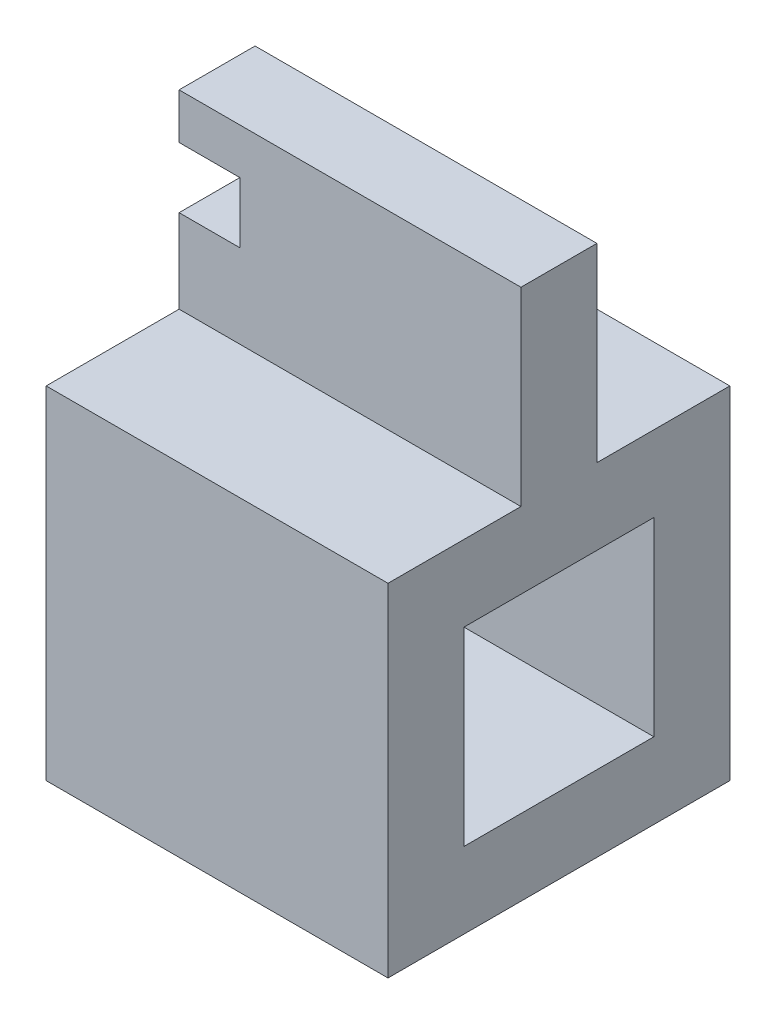
ISO-10303-21;
HEADER;
FILE_DESCRIPTION(('STEP AP214'),'2;1');
FILE_NAME('part.step','',(''),(''),'','','');
FILE_SCHEMA(('AUTOMOTIVE_DESIGN { 1 0 10303 214 1 1 1 1 }'));
ENDSEC;
DATA;
#1=APPLICATION_CONTEXT('core data for automotive mechanical design processes');
#2=APPLICATION_PROTOCOL_DEFINITION('international standard','automotive_design',2000,#1);
#3=PRODUCT_CONTEXT('',#1,'mechanical');
#4=PRODUCT('Part','Part','',(#3));
#5=PRODUCT_RELATED_PRODUCT_CATEGORY('part','',(#4));
#6=PRODUCT_DEFINITION_FORMATION('','',#4);
#7=PRODUCT_DEFINITION_CONTEXT('part definition',#1,'design');
#8=PRODUCT_DEFINITION('design','',#6,#7);
#9=PRODUCT_DEFINITION_SHAPE('','',#8);
#10=(LENGTH_UNIT() NAMED_UNIT(*) SI_UNIT(.MILLI.,.METRE.));
#11=(NAMED_UNIT(*) PLANE_ANGLE_UNIT() SI_UNIT($,.RADIAN.));
#12=(NAMED_UNIT(*) SI_UNIT($,.STERADIAN.) SOLID_ANGLE_UNIT());
#13=UNCERTAINTY_MEASURE_WITH_UNIT(LENGTH_MEASURE(1.E-05),#10,'distance_accuracy_value','');
#14=(GEOMETRIC_REPRESENTATION_CONTEXT(3) GLOBAL_UNCERTAINTY_ASSIGNED_CONTEXT((#13)) GLOBAL_UNIT_ASSIGNED_CONTEXT((#10,
#11,#12)) REPRESENTATION_CONTEXT('',''));
#15=CARTESIAN_POINT('',(0.,0.,0.));
#16=DIRECTION('',(0.,0.,1.));
#17=DIRECTION('',(1.,0.,0.));
#18=AXIS2_PLACEMENT_3D('',#15,#16,#17);
#19=CARTESIAN_POINT('',(0.,0.,0.));
#20=DIRECTION('',(1.,0.,0.));
#21=DIRECTION('',(0.,0.,-1.));
#22=AXIS2_PLACEMENT_3D('',#19,#20,#21);
#23=PLANE('',#22);
#24=DIRECTION('',(0.,-1.,0.));
#25=VECTOR('',#24,1.);
#26=CARTESIAN_POINT('',(0.,-2.5,2.5));
#27=LINE('',#26,#25);
#28=CARTESIAN_POINT('',(0.,2.5,2.5));
#29=VERTEX_POINT('',#28);
#30=CARTESIAN_POINT('',(0.,-2.5,2.5));
#31=VERTEX_POINT('',#30);
#32=EDGE_CURVE('E183',#29,#31,#27,.T.);
#33=ORIENTED_EDGE('',*,*,#32,.T.);
#34=DIRECTION('',(0.,0.,-1.));
#35=VECTOR('',#34,1.);
#36=CARTESIAN_POINT('',(0.,-2.5,-2.5));
#37=LINE('',#36,#35);
#38=CARTESIAN_POINT('',(0.,-2.5,-2.5));
#39=VERTEX_POINT('',#38);
#40=EDGE_CURVE('E197',#31,#39,#37,.T.);
#41=ORIENTED_EDGE('',*,*,#40,.T.);
#42=DIRECTION('',(0.,1.,0.));
#43=VECTOR('',#42,1.);
#44=CARTESIAN_POINT('',(0.,-2.5,-2.5));
#45=LINE('',#44,#43);
#46=CARTESIAN_POINT('',(0.,2.5,-2.5));
#47=VERTEX_POINT('',#46);
#48=EDGE_CURVE('E200',#39,#47,#45,.T.);
#49=ORIENTED_EDGE('',*,*,#48,.T.);
#50=DIRECTION('',(0.,0.,1.));
#51=VECTOR('',#50,1.);
#52=CARTESIAN_POINT('',(0.,2.5,-2.5));
#53=LINE('',#52,#51);
#54=EDGE_CURVE('E187',#47,#29,#53,.T.);
#55=ORIENTED_EDGE('',*,*,#54,.T.);
#56=EDGE_LOOP('',(#33,#41,#49,#55));
#57=FACE_BOUND('',#56,.T.);
#58=DIRECTION('',(0.,0.,1.));
#59=VECTOR('',#58,1.);
#60=CARTESIAN_POINT('',(0.,6.7,-4.));
#61=LINE('',#60,#59);
#62=CARTESIAN_POINT('',(0.,6.7,-0.999999999999998));
#63=VERTEX_POINT('',#62);
#64=CARTESIAN_POINT('',(0.,6.7,0.999999999999999));
#65=VERTEX_POINT('',#64);
#66=EDGE_CURVE('E167',#63,#65,#61,.T.);
#67=ORIENTED_EDGE('',*,*,#66,.F.);
#68=DIRECTION('',(0.,-1.,0.));
#69=VECTOR('',#68,1.);
#70=CARTESIAN_POINT('',(0.,9.5,-0.999999999999999));
#71=LINE('',#70,#69);
#72=CARTESIAN_POINT('',(0.,4.5,-0.999999999999999));
#73=VERTEX_POINT('',#72);
#74=EDGE_CURVE('E172',#63,#73,#71,.T.);
#75=ORIENTED_EDGE('',*,*,#74,.T.);
#76=DIRECTION('',(0.,0.,1.));
#77=VECTOR('',#76,1.);
#78=CARTESIAN_POINT('',(0.,4.5,-4.5));
#79=LINE('',#78,#77);
#80=CARTESIAN_POINT('',(0.,4.5,-4.5));
#81=VERTEX_POINT('',#80);
#82=EDGE_CURVE('E219',#81,#73,#79,.T.);
#83=ORIENTED_EDGE('',*,*,#82,.F.);
#84=DIRECTION('',(0.,1.,0.));
#85=VECTOR('',#84,1.);
#86=CARTESIAN_POINT('',(0.,-4.5,-4.5));
#87=LINE('',#86,#85);
#88=CARTESIAN_POINT('',(0.,-4.5,-4.5));
#89=VERTEX_POINT('',#88);
#90=EDGE_CURVE('E231',#89,#81,#87,.T.);
#91=ORIENTED_EDGE('',*,*,#90,.F.);
#92=DIRECTION('',(0.,0.,-1.));
#93=VECTOR('',#92,1.);
#94=CARTESIAN_POINT('',(0.,-4.5,-4.5));
#95=LINE('',#94,#93);
#96=CARTESIAN_POINT('',(0.,-4.5,4.5));
#97=VERTEX_POINT('',#96);
#98=EDGE_CURVE('E229',#97,#89,#95,.T.);
#99=ORIENTED_EDGE('',*,*,#98,.F.);
#100=DIRECTION('',(0.,-1.,0.));
#101=VECTOR('',#100,1.);
#102=CARTESIAN_POINT('',(0.,-4.5,4.5));
#103=LINE('',#102,#101);
#104=CARTESIAN_POINT('',(0.,4.5,4.5));
#105=VERTEX_POINT('',#104);
#106=EDGE_CURVE('E214',#105,#97,#103,.T.);
#107=ORIENTED_EDGE('',*,*,#106,.F.);
#108=CARTESIAN_POINT('',(0.,4.5,1.));
#109=VERTEX_POINT('',#108);
#110=EDGE_CURVE('E233',#109,#105,#79,.T.);
#111=ORIENTED_EDGE('',*,*,#110,.F.);
#112=DIRECTION('',(0.,-1.,0.));
#113=VECTOR('',#112,1.);
#114=CARTESIAN_POINT('',(0.,9.5,1.));
#115=LINE('',#114,#113);
#116=EDGE_CURVE('E173',#65,#109,#115,.T.);
#117=ORIENTED_EDGE('',*,*,#116,.F.);
#118=EDGE_LOOP('',(#67,#75,#83,#91,#99,#107,#111,#117));
#119=FACE_BOUND('',#118,.T.);
#120=ADVANCED_FACE('F34',(#57,#119),#23,.F.);
#121=CARTESIAN_POINT('',(0.,9.5,-0.999999999999998));
#122=DIRECTION('',(0.,0.,1.));
#123=DIRECTION('',(1.,0.,0.));
#124=AXIS2_PLACEMENT_3D('',#121,#122,#123);
#125=PLANE('',#124);
#126=DIRECTION('',(-1.,0.,0.));
#127=VECTOR('',#126,1.);
#128=CARTESIAN_POINT('',(0.,6.7,-0.999999999999998));
#129=LINE('',#128,#127);
#130=CARTESIAN_POINT('',(1.6,6.7,-0.999999999999998));
#131=VERTEX_POINT('',#130);
#132=EDGE_CURVE('E267',#131,#63,#129,.T.);
#133=ORIENTED_EDGE('',*,*,#132,.F.);
#134=DIRECTION('',(0.,1.,0.));
#135=VECTOR('',#134,1.);
#136=CARTESIAN_POINT('',(1.6,9.5,-0.999999999999998));
#137=LINE('',#136,#135);
#138=CARTESIAN_POINT('',(1.6,8.3,-0.999999999999998));
#139=VERTEX_POINT('',#138);
#140=EDGE_CURVE('E263',#131,#139,#137,.T.);
#141=ORIENTED_EDGE('',*,*,#140,.T.);
#142=DIRECTION('',(-1.,0.,0.));
#143=VECTOR('',#142,1.);
#144=CARTESIAN_POINT('',(0.,8.3,-0.999999999999998));
#145=LINE('',#144,#143);
#146=CARTESIAN_POINT('',(0.,8.3,-0.999999999999998));
#147=VERTEX_POINT('',#146);
#148=EDGE_CURVE('E278',#139,#147,#145,.T.);
#149=ORIENTED_EDGE('',*,*,#148,.T.);
#150=CARTESIAN_POINT('',(0.,9.5,-0.999999999999999));
#151=VERTEX_POINT('',#150);
#152=EDGE_CURVE('E166',#151,#147,#71,.T.);
#153=ORIENTED_EDGE('',*,*,#152,.F.);
#154=DIRECTION('',(-1.,0.,0.));
#155=VECTOR('',#154,1.);
#156=CARTESIAN_POINT('',(0.,9.5,-0.999999999999998));
#157=LINE('',#156,#155);
#158=CARTESIAN_POINT('',(9.,9.5,-0.999999999999999));
#159=VERTEX_POINT('',#158);
#160=EDGE_CURVE('E273',#159,#151,#157,.T.);
#161=ORIENTED_EDGE('',*,*,#160,.F.);
#162=DIRECTION('',(0.,-1.,0.));
#163=VECTOR('',#162,1.);
#164=CARTESIAN_POINT('',(9.,9.5,-0.999999999999999));
#165=LINE('',#164,#163);
#166=CARTESIAN_POINT('',(9.,4.5,-0.999999999999999));
#167=VERTEX_POINT('',#166);
#168=EDGE_CURVE('E180',#159,#167,#165,.T.);
#169=ORIENTED_EDGE('',*,*,#168,.T.);
#170=DIRECTION('',(-1.,0.,0.));
#171=VECTOR('',#170,1.);
#172=CARTESIAN_POINT('',(0.,4.5,-0.999999999999999));
#173=LINE('',#172,#171);
#174=EDGE_CURVE('E257',#167,#73,#173,.T.);
#175=ORIENTED_EDGE('',*,*,#174,.T.);
#176=ORIENTED_EDGE('',*,*,#74,.F.);
#177=EDGE_LOOP('',(#133,#141,#149,#153,#161,#169,#175,#176));
#178=FACE_BOUND('',#177,.T.);
#179=ADVANCED_FACE('F260',(#178),#125,.F.);
#180=CARTESIAN_POINT('',(0.,9.5,1.));
#181=DIRECTION('',(0.,0.,1.));
#182=DIRECTION('',(1.,0.,0.));
#183=AXIS2_PLACEMENT_3D('',#180,#181,#182);
#184=PLANE('',#183);
#185=DIRECTION('',(0.,1.,0.));
#186=VECTOR('',#185,1.);
#187=CARTESIAN_POINT('',(1.6,0.,0.999999999999999));
#188=LINE('',#187,#186);
#189=CARTESIAN_POINT('',(1.6,6.7,0.999999999999999));
#190=VERTEX_POINT('',#189);
#191=CARTESIAN_POINT('',(1.6,8.3,1.));
#192=VERTEX_POINT('',#191);
#193=EDGE_CURVE('E49',#190,#192,#188,.T.);
#194=ORIENTED_EDGE('',*,*,#193,.F.);
#195=DIRECTION('',(-1.,0.,0.));
#196=VECTOR('',#195,1.);
#197=CARTESIAN_POINT('',(0.,6.7,0.999999999999999));
#198=LINE('',#197,#196);
#199=EDGE_CURVE('E156',#190,#65,#198,.T.);
#200=ORIENTED_EDGE('',*,*,#199,.T.);
#201=ORIENTED_EDGE('',*,*,#116,.T.);
#202=DIRECTION('',(-1.,0.,0.));
#203=VECTOR('',#202,1.);
#204=CARTESIAN_POINT('',(0.,4.5,0.999999999999999));
#205=LINE('',#204,#203);
#206=CARTESIAN_POINT('',(9.,4.5,1.));
#207=VERTEX_POINT('',#206);
#208=EDGE_CURVE('E262',#207,#109,#205,.T.);
#209=ORIENTED_EDGE('',*,*,#208,.F.);
#210=DIRECTION('',(0.,-1.,0.));
#211=VECTOR('',#210,1.);
#212=CARTESIAN_POINT('',(9.,9.5,1.));
#213=LINE('',#212,#211);
#214=CARTESIAN_POINT('',(9.,9.5,1.));
#215=VERTEX_POINT('',#214);
#216=EDGE_CURVE('E176',#215,#207,#213,.T.);
#217=ORIENTED_EDGE('',*,*,#216,.F.);
#218=DIRECTION('',(-1.,0.,0.));
#219=VECTOR('',#218,1.);
#220=CARTESIAN_POINT('',(0.,9.5,1.));
#221=LINE('',#220,#219);
#222=CARTESIAN_POINT('',(0.,9.5,1.));
#223=VERTEX_POINT('',#222);
#224=EDGE_CURVE('E171',#215,#223,#221,.T.);
#225=ORIENTED_EDGE('',*,*,#224,.T.);
#226=CARTESIAN_POINT('',(0.,8.3,0.999999999999999));
#227=VERTEX_POINT('',#226);
#228=EDGE_CURVE('E163',#223,#227,#115,.T.);
#229=ORIENTED_EDGE('',*,*,#228,.T.);
#230=DIRECTION('',(-1.,0.,0.));
#231=VECTOR('',#230,1.);
#232=CARTESIAN_POINT('',(0.,8.3,0.999999999999999));
#233=LINE('',#232,#231);
#234=EDGE_CURVE('E148',#192,#227,#233,.T.);
#235=ORIENTED_EDGE('',*,*,#234,.F.);
#236=EDGE_LOOP('',(#194,#200,#201,#209,#217,#225,#229,#235));
#237=FACE_BOUND('',#236,.T.);
#238=ADVANCED_FACE('F169',(#237),#184,.T.);
#239=CARTESIAN_POINT('',(9.,4.5,-4.5));
#240=DIRECTION('',(0.,-1.,0.));
#241=DIRECTION('',(0.,0.,-1.));
#242=AXIS2_PLACEMENT_3D('',#239,#240,#241);
#243=PLANE('',#242);
#244=ORIENTED_EDGE('',*,*,#174,.F.);
#245=DIRECTION('',(0.,0.,1.));
#246=VECTOR('',#245,1.);
#247=CARTESIAN_POINT('',(9.,4.5,-4.5));
#248=LINE('',#247,#246);
#249=CARTESIAN_POINT('',(9.,4.5,-4.5));
#250=VERTEX_POINT('',#249);
#251=EDGE_CURVE('E223',#250,#167,#248,.T.);
#252=ORIENTED_EDGE('',*,*,#251,.F.);
#253=DIRECTION('',(-1.,0.,0.));
#254=VECTOR('',#253,1.);
#255=CARTESIAN_POINT('',(9.,4.5,-4.5));
#256=LINE('',#255,#254);
#257=EDGE_CURVE('E238',#250,#81,#256,.T.);
#258=ORIENTED_EDGE('',*,*,#257,.T.);
#259=ORIENTED_EDGE('',*,*,#82,.T.);
#260=EDGE_LOOP('',(#244,#252,#258,#259));
#261=FACE_BOUND('',#260,.T.);
#262=ADVANCED_FACE('F255',(#261),#243,.F.);
#263=CARTESIAN_POINT('',(9.,0.,0.));
#264=DIRECTION('',(1.,0.,0.));
#265=DIRECTION('',(0.,0.,-1.));
#266=AXIS2_PLACEMENT_3D('',#263,#264,#265);
#267=PLANE('',#266);
#268=DIRECTION('',(0.,-1.,0.));
#269=VECTOR('',#268,1.);
#270=CARTESIAN_POINT('',(9.,-4.5,4.5));
#271=LINE('',#270,#269);
#272=CARTESIAN_POINT('',(9.,4.5,4.5));
#273=VERTEX_POINT('',#272);
#274=CARTESIAN_POINT('',(9.,-4.5,4.5));
#275=VERTEX_POINT('',#274);
#276=EDGE_CURVE('E215',#273,#275,#271,.T.);
#277=ORIENTED_EDGE('',*,*,#276,.T.);
#278=DIRECTION('',(0.,0.,-1.));
#279=VECTOR('',#278,1.);
#280=CARTESIAN_POINT('',(9.,-4.5,-4.5));
#281=LINE('',#280,#279);
#282=CARTESIAN_POINT('',(9.,-4.5,-4.5));
#283=VERTEX_POINT('',#282);
#284=EDGE_CURVE('E218',#275,#283,#281,.T.);
#285=ORIENTED_EDGE('',*,*,#284,.T.);
#286=DIRECTION('',(0.,1.,0.));
#287=VECTOR('',#286,1.);
#288=CARTESIAN_POINT('',(9.,-4.5,-4.5));
#289=LINE('',#288,#287);
#290=EDGE_CURVE('E221',#283,#250,#289,.T.);
#291=ORIENTED_EDGE('',*,*,#290,.T.);
#292=ORIENTED_EDGE('',*,*,#251,.T.);
#293=ORIENTED_EDGE('',*,*,#168,.F.);
#294=DIRECTION('',(0.,0.,-1.));
#295=VECTOR('',#294,1.);
#296=CARTESIAN_POINT('',(9.,9.5,0.));
#297=LINE('',#296,#295);
#298=EDGE_CURVE('E265',#215,#159,#297,.T.);
#299=ORIENTED_EDGE('',*,*,#298,.F.);
#300=ORIENTED_EDGE('',*,*,#216,.T.);
#301=EDGE_CURVE('E57',#207,#273,#248,.T.);
#302=ORIENTED_EDGE('',*,*,#301,.T.);
#303=EDGE_LOOP('',(#277,#285,#291,#292,#293,#299,#300,#302));
#304=FACE_BOUND('',#303,.T.);
#305=DIRECTION('',(0.,0.,-1.));
#306=VECTOR('',#305,1.);
#307=CARTESIAN_POINT('',(9.,-2.5,-2.5));
#308=LINE('',#307,#306);
#309=CARTESIAN_POINT('',(9.,-2.5,2.5));
#310=VERTEX_POINT('',#309);
#311=CARTESIAN_POINT('',(9.,-2.5,-2.5));
#312=VERTEX_POINT('',#311);
#313=EDGE_CURVE('E186',#310,#312,#308,.T.);
#314=ORIENTED_EDGE('',*,*,#313,.F.);
#315=DIRECTION('',(0.,-1.,0.));
#316=VECTOR('',#315,1.);
#317=CARTESIAN_POINT('',(9.,-2.5,2.5));
#318=LINE('',#317,#316);
#319=CARTESIAN_POINT('',(9.,2.5,2.5));
#320=VERTEX_POINT('',#319);
#321=EDGE_CURVE('E184',#320,#310,#318,.T.);
#322=ORIENTED_EDGE('',*,*,#321,.F.);
#323=DIRECTION('',(0.,0.,1.));
#324=VECTOR('',#323,1.);
#325=CARTESIAN_POINT('',(9.,2.5,-2.5));
#326=LINE('',#325,#324);
#327=CARTESIAN_POINT('',(9.,2.5,-2.5));
#328=VERTEX_POINT('',#327);
#329=EDGE_CURVE('E192',#328,#320,#326,.T.);
#330=ORIENTED_EDGE('',*,*,#329,.F.);
#331=DIRECTION('',(0.,1.,0.));
#332=VECTOR('',#331,1.);
#333=CARTESIAN_POINT('',(9.,-2.5,-2.5));
#334=LINE('',#333,#332);
#335=EDGE_CURVE('E189',#312,#328,#334,.T.);
#336=ORIENTED_EDGE('',*,*,#335,.F.);
#337=EDGE_LOOP('',(#314,#322,#330,#336));
#338=FACE_BOUND('',#337,.T.);
#339=ADVANCED_FACE('F297',(#304,#338),#267,.T.);
#340=ORIENTED_EDGE('',*,*,#152,.T.);
#341=DIRECTION('',(0.,0.,1.));
#342=VECTOR('',#341,1.);
#343=CARTESIAN_POINT('',(0.,8.3,-4.));
#344=LINE('',#343,#342);
#345=EDGE_CURVE('E151',#147,#227,#344,.T.);
#346=ORIENTED_EDGE('',*,*,#345,.T.);
#347=ORIENTED_EDGE('',*,*,#228,.F.);
#348=DIRECTION('',(0.,0.,1.));
#349=VECTOR('',#348,1.);
#350=CARTESIAN_POINT('',(0.,9.5,0.));
#351=LINE('',#350,#349);
#352=EDGE_CURVE('E271',#151,#223,#351,.T.);
#353=ORIENTED_EDGE('',*,*,#352,.F.);
#354=EDGE_LOOP('',(#340,#346,#347,#353));
#355=FACE_BOUND('',#354,.T.);
#356=ADVANCED_FACE('F161',(#355),#23,.F.);
#357=CARTESIAN_POINT('',(9.,-4.5,4.5));
#358=DIRECTION('',(0.,0.,-1.));
#359=DIRECTION('',(0.,1.,0.));
#360=AXIS2_PLACEMENT_3D('',#357,#358,#359);
#361=PLANE('',#360);
#362=ORIENTED_EDGE('',*,*,#106,.T.);
#363=DIRECTION('',(-1.,0.,0.));
#364=VECTOR('',#363,1.);
#365=CARTESIAN_POINT('',(9.,-4.5,4.5));
#366=LINE('',#365,#364);
#367=EDGE_CURVE('E11',#275,#97,#366,.T.);
#368=ORIENTED_EDGE('',*,*,#367,.F.);
#369=ORIENTED_EDGE('',*,*,#276,.F.);
#370=DIRECTION('',(-1.,0.,0.));
#371=VECTOR('',#370,1.);
#372=CARTESIAN_POINT('',(9.,4.5,4.5));
#373=LINE('',#372,#371);
#374=EDGE_CURVE('E226',#273,#105,#373,.T.);
#375=ORIENTED_EDGE('',*,*,#374,.T.);
#376=EDGE_LOOP('',(#362,#368,#369,#375));
#377=FACE_BOUND('',#376,.T.);
#378=ADVANCED_FACE('F36',(#377),#361,.F.);
#379=CARTESIAN_POINT('',(9.,-4.5,-4.5));
#380=DIRECTION('',(0.,1.,0.));
#381=DIRECTION('',(0.,0.,1.));
#382=AXIS2_PLACEMENT_3D('',#379,#380,#381);
#383=PLANE('',#382);
#384=ORIENTED_EDGE('',*,*,#98,.T.);
#385=DIRECTION('',(-1.,0.,0.));
#386=VECTOR('',#385,1.);
#387=CARTESIAN_POINT('',(9.,-4.5,-4.5));
#388=LINE('',#387,#386);
#389=EDGE_CURVE('E42',#283,#89,#388,.T.);
#390=ORIENTED_EDGE('',*,*,#389,.F.);
#391=ORIENTED_EDGE('',*,*,#284,.F.);
#392=ORIENTED_EDGE('',*,*,#367,.T.);
#393=EDGE_LOOP('',(#384,#390,#391,#392));
#394=FACE_BOUND('',#393,.T.);
#395=ADVANCED_FACE('F326',(#394),#383,.F.);
#396=CARTESIAN_POINT('',(9.,-4.5,-4.5));
#397=DIRECTION('',(0.,0.,1.));
#398=DIRECTION('',(0.,-1.,0.));
#399=AXIS2_PLACEMENT_3D('',#396,#397,#398);
#400=PLANE('',#399);
#401=ORIENTED_EDGE('',*,*,#90,.T.);
#402=ORIENTED_EDGE('',*,*,#257,.F.);
#403=ORIENTED_EDGE('',*,*,#290,.F.);
#404=ORIENTED_EDGE('',*,*,#389,.T.);
#405=EDGE_LOOP('',(#401,#402,#403,#404));
#406=FACE_BOUND('',#405,.T.);
#407=ADVANCED_FACE('F245',(#406),#400,.F.);
#408=ORIENTED_EDGE('',*,*,#301,.F.);
#409=ORIENTED_EDGE('',*,*,#208,.T.);
#410=ORIENTED_EDGE('',*,*,#110,.T.);
#411=ORIENTED_EDGE('',*,*,#374,.F.);
#412=EDGE_LOOP('',(#408,#409,#410,#411));
#413=FACE_BOUND('',#412,.T.);
#414=ADVANCED_FACE('F292',(#413),#243,.F.);
#415=CARTESIAN_POINT('',(9.,-2.5,2.5));
#416=DIRECTION('',(0.,0.,-1.));
#417=DIRECTION('',(-1.,0.,0.));
#418=AXIS2_PLACEMENT_3D('',#415,#416,#417);
#419=PLANE('',#418);
#420=ORIENTED_EDGE('',*,*,#32,.F.);
#421=DIRECTION('',(-1.,0.,0.));
#422=VECTOR('',#421,1.);
#423=CARTESIAN_POINT('',(9.,2.5,2.5));
#424=LINE('',#423,#422);
#425=EDGE_CURVE('E194',#320,#29,#424,.T.);
#426=ORIENTED_EDGE('',*,*,#425,.F.);
#427=ORIENTED_EDGE('',*,*,#321,.T.);
#428=DIRECTION('',(-1.,0.,0.));
#429=VECTOR('',#428,1.);
#430=CARTESIAN_POINT('',(9.,-2.5,2.5));
#431=LINE('',#430,#429);
#432=EDGE_CURVE('E211',#310,#31,#431,.T.);
#433=ORIENTED_EDGE('',*,*,#432,.T.);
#434=EDGE_LOOP('',(#420,#426,#427,#433));
#435=FACE_BOUND('',#434,.T.);
#436=ADVANCED_FACE('F331',(#435),#419,.T.);
#437=CARTESIAN_POINT('',(9.,-2.5,-2.5));
#438=DIRECTION('',(0.,1.,0.));
#439=DIRECTION('',(0.,0.,1.));
#440=AXIS2_PLACEMENT_3D('',#437,#438,#439);
#441=PLANE('',#440);
#442=ORIENTED_EDGE('',*,*,#40,.F.);
#443=ORIENTED_EDGE('',*,*,#432,.F.);
#444=ORIENTED_EDGE('',*,*,#313,.T.);
#445=DIRECTION('',(-1.,0.,0.));
#446=VECTOR('',#445,1.);
#447=CARTESIAN_POINT('',(9.,-2.5,-2.5));
#448=LINE('',#447,#446);
#449=EDGE_CURVE('E209',#312,#39,#448,.T.);
#450=ORIENTED_EDGE('',*,*,#449,.T.);
#451=EDGE_LOOP('',(#442,#443,#444,#450));
#452=FACE_BOUND('',#451,.T.);
#453=ADVANCED_FACE('F334',(#452),#441,.T.);
#454=CARTESIAN_POINT('',(9.,-2.5,-2.5));
#455=DIRECTION('',(0.,0.,1.));
#456=DIRECTION('',(1.,0.,0.));
#457=AXIS2_PLACEMENT_3D('',#454,#455,#456);
#458=PLANE('',#457);
#459=ORIENTED_EDGE('',*,*,#48,.F.);
#460=ORIENTED_EDGE('',*,*,#449,.F.);
#461=ORIENTED_EDGE('',*,*,#335,.T.);
#462=DIRECTION('',(-1.,0.,0.));
#463=VECTOR('',#462,1.);
#464=CARTESIAN_POINT('',(9.,2.5,-2.5));
#465=LINE('',#464,#463);
#466=EDGE_CURVE('E207',#328,#47,#465,.T.);
#467=ORIENTED_EDGE('',*,*,#466,.T.);
#468=EDGE_LOOP('',(#459,#460,#461,#467));
#469=FACE_BOUND('',#468,.T.);
#470=ADVANCED_FACE('F338',(#469),#458,.T.);
#471=CARTESIAN_POINT('',(9.,2.5,-2.5));
#472=DIRECTION('',(0.,-1.,0.));
#473=DIRECTION('',(0.,0.,-1.));
#474=AXIS2_PLACEMENT_3D('',#471,#472,#473);
#475=PLANE('',#474);
#476=ORIENTED_EDGE('',*,*,#54,.F.);
#477=ORIENTED_EDGE('',*,*,#466,.F.);
#478=ORIENTED_EDGE('',*,*,#329,.T.);
#479=ORIENTED_EDGE('',*,*,#425,.T.);
#480=EDGE_LOOP('',(#476,#477,#478,#479));
#481=FACE_BOUND('',#480,.T.);
#482=ADVANCED_FACE('F342',(#481),#475,.T.);
#483=CARTESIAN_POINT('',(0.,9.5,0.));
#484=DIRECTION('',(0.,1.,0.));
#485=DIRECTION('',(0.,0.,1.));
#486=AXIS2_PLACEMENT_3D('',#483,#484,#485);
#487=PLANE('',#486);
#488=ORIENTED_EDGE('',*,*,#298,.T.);
#489=ORIENTED_EDGE('',*,*,#160,.T.);
#490=ORIENTED_EDGE('',*,*,#352,.T.);
#491=ORIENTED_EDGE('',*,*,#224,.F.);
#492=EDGE_LOOP('',(#488,#489,#490,#491));
#493=FACE_BOUND('',#492,.T.);
#494=ADVANCED_FACE('F301',(#493),#487,.T.);
#495=CARTESIAN_POINT('',(1.6,0.,-4.));
#496=DIRECTION('',(1.,0.,0.));
#497=DIRECTION('',(0.,0.,-1.));
#498=AXIS2_PLACEMENT_3D('',#495,#496,#497);
#499=PLANE('',#498);
#500=DIRECTION('',(0.,0.,1.));
#501=VECTOR('',#500,1.);
#502=CARTESIAN_POINT('',(1.6,6.7,-4.));
#503=LINE('',#502,#501);
#504=EDGE_CURVE('E280',#131,#190,#503,.T.);
#505=ORIENTED_EDGE('',*,*,#504,.T.);
#506=ORIENTED_EDGE('',*,*,#193,.T.);
#507=DIRECTION('',(0.,0.,1.));
#508=VECTOR('',#507,1.);
#509=CARTESIAN_POINT('',(1.6,8.3,-4.));
#510=LINE('',#509,#508);
#511=EDGE_CURVE('E153',#139,#192,#510,.T.);
#512=ORIENTED_EDGE('',*,*,#511,.F.);
#513=ORIENTED_EDGE('',*,*,#140,.F.);
#514=EDGE_LOOP('',(#505,#506,#512,#513));
#515=FACE_BOUND('',#514,.T.);
#516=ADVANCED_FACE('F302',(#515),#499,.F.);
#517=CARTESIAN_POINT('',(0.,6.7,-4.));
#518=DIRECTION('',(0.,1.,0.));
#519=DIRECTION('',(0.,0.,1.));
#520=AXIS2_PLACEMENT_3D('',#517,#518,#519);
#521=PLANE('',#520);
#522=ORIENTED_EDGE('',*,*,#132,.T.);
#523=ORIENTED_EDGE('',*,*,#66,.T.);
#524=ORIENTED_EDGE('',*,*,#199,.F.);
#525=ORIENTED_EDGE('',*,*,#504,.F.);
#526=EDGE_LOOP('',(#522,#523,#524,#525));
#527=FACE_BOUND('',#526,.T.);
#528=ADVANCED_FACE('F303',(#527),#521,.T.);
#529=CARTESIAN_POINT('',(0.,8.3,-4.));
#530=DIRECTION('',(0.,1.,0.));
#531=DIRECTION('',(0.,0.,1.));
#532=AXIS2_PLACEMENT_3D('',#529,#530,#531);
#533=PLANE('',#532);
#534=ORIENTED_EDGE('',*,*,#511,.T.);
#535=ORIENTED_EDGE('',*,*,#234,.T.);
#536=ORIENTED_EDGE('',*,*,#345,.F.);
#537=ORIENTED_EDGE('',*,*,#148,.F.);
#538=EDGE_LOOP('',(#534,#535,#536,#537));
#539=FACE_BOUND('',#538,.T.);
#540=ADVANCED_FACE('F150',(#539),#533,.F.);
#541=CLOSED_SHELL('',(#120,#179,#238,#262,#339,#356,#378,#395,#407,#414,#436,#453,#470,#482,
#494,#516,#528,#540));
#542=MANIFOLD_SOLID_BREP('B2',#541);
#543=ADVANCED_BREP_SHAPE_REPRESENTATION('',(#18,#542),#14);
#544=SHAPE_DEFINITION_REPRESENTATION(#9,#543);
ENDSEC;
END-ISO-10303-21;
